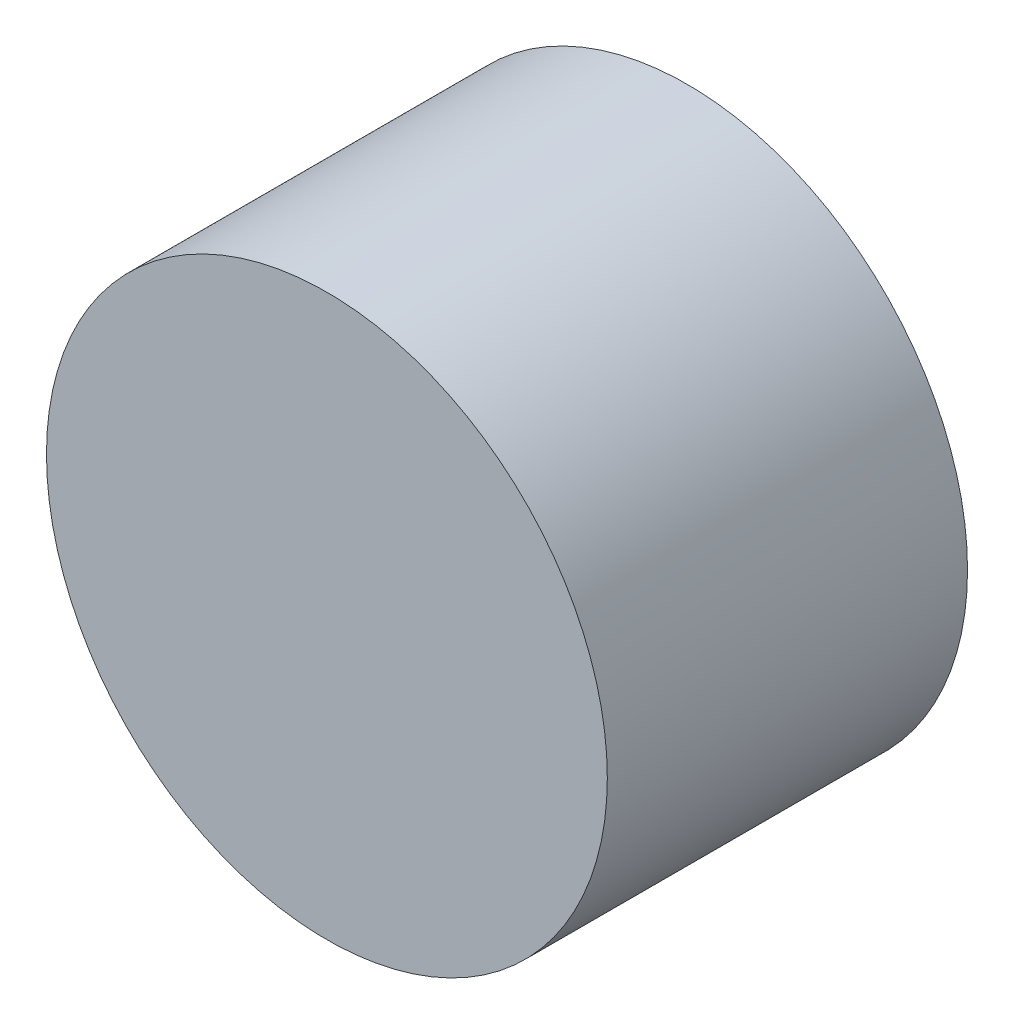
ISO-10303-21;
HEADER;
FILE_DESCRIPTION(('STEP AP214'),'2;1');
FILE_NAME('part.step','',(''),(''),'','','');
FILE_SCHEMA(('AUTOMOTIVE_DESIGN { 1 0 10303 214 1 1 1 1 }'));
ENDSEC;
DATA;
#1=APPLICATION_CONTEXT('core data for automotive mechanical design processes');
#2=APPLICATION_PROTOCOL_DEFINITION('international standard','automotive_design',2000,#1);
#3=PRODUCT_CONTEXT('',#1,'mechanical');
#4=PRODUCT('Part','Part','',(#3));
#5=PRODUCT_RELATED_PRODUCT_CATEGORY('part','',(#4));
#6=PRODUCT_DEFINITION_FORMATION('','',#4);
#7=PRODUCT_DEFINITION_CONTEXT('part definition',#1,'design');
#8=PRODUCT_DEFINITION('design','',#6,#7);
#9=PRODUCT_DEFINITION_SHAPE('','',#8);
#10=(LENGTH_UNIT() NAMED_UNIT(*) SI_UNIT(.MILLI.,.METRE.));
#11=(NAMED_UNIT(*) PLANE_ANGLE_UNIT() SI_UNIT($,.RADIAN.));
#12=(NAMED_UNIT(*) SI_UNIT($,.STERADIAN.) SOLID_ANGLE_UNIT());
#13=UNCERTAINTY_MEASURE_WITH_UNIT(LENGTH_MEASURE(1.E-05),#10,'distance_accuracy_value','');
#14=(GEOMETRIC_REPRESENTATION_CONTEXT(3) GLOBAL_UNCERTAINTY_ASSIGNED_CONTEXT((#13)) GLOBAL_UNIT_ASSIGNED_CONTEXT((#10,
#11,#12)) REPRESENTATION_CONTEXT('',''));
#15=CARTESIAN_POINT('',(0.,0.,0.));
#16=DIRECTION('',(0.,0.,1.));
#17=DIRECTION('',(1.,0.,0.));
#18=AXIS2_PLACEMENT_3D('',#15,#16,#17);
#19=CARTESIAN_POINT('',(0.,0.,66.04));
#20=DIRECTION('',(0.,0.,-1.));
#21=DIRECTION('',(-1.,0.,0.));
#22=AXIS2_PLACEMENT_3D('',#19,#20,#21);
#23=CYLINDRICAL_SURFACE('',#22,51.414167009829);
#24=CARTESIAN_POINT('',(0.,0.,66.04));
#25=DIRECTION('',(0.,0.,1.));
#26=DIRECTION('',(1.,0.,0.));
#27=AXIS2_PLACEMENT_3D('',#24,#25,#26);
#28=CIRCLE('',#27,51.414167009829);
#29=CARTESIAN_POINT('',(51.414167009829,0.,66.04));
#30=VERTEX_POINT('',#29);
#31=EDGE_CURVE('E10',#30,#30,#28,.T.);
#32=ORIENTED_EDGE('',*,*,#31,.F.);
#33=EDGE_LOOP('',(#32));
#34=FACE_BOUND('',#33,.T.);
#35=CARTESIAN_POINT('',(0.,0.,0.));
#36=DIRECTION('',(0.,0.,1.));
#37=DIRECTION('',(1.,0.,0.));
#38=AXIS2_PLACEMENT_3D('',#35,#36,#37);
#39=CIRCLE('',#38,51.414167009829);
#40=CARTESIAN_POINT('',(51.414167009829,0.,0.));
#41=VERTEX_POINT('',#40);
#42=EDGE_CURVE('E34',#41,#41,#39,.T.);
#43=ORIENTED_EDGE('',*,*,#42,.T.);
#44=EDGE_LOOP('',(#43));
#45=FACE_BOUND('',#44,.T.);
#46=ADVANCED_FACE('F31',(#34,#45),#23,.T.);
#47=CARTESIAN_POINT('',(0.,0.,66.04));
#48=DIRECTION('',(0.,0.,1.));
#49=DIRECTION('',(1.,0.,0.));
#50=AXIS2_PLACEMENT_3D('',#47,#48,#49);
#51=PLANE('',#50);
#52=ORIENTED_EDGE('',*,*,#31,.T.);
#53=EDGE_LOOP('',(#52));
#54=FACE_BOUND('',#53,.T.);
#55=ADVANCED_FACE('F46',(#54),#51,.T.);
#56=CARTESIAN_POINT('',(0.,0.,0.));
#57=DIRECTION('',(0.,0.,1.));
#58=DIRECTION('',(1.,0.,0.));
#59=AXIS2_PLACEMENT_3D('',#56,#57,#58);
#60=PLANE('',#59);
#61=ORIENTED_EDGE('',*,*,#42,.F.);
#62=EDGE_LOOP('',(#61));
#63=FACE_BOUND('',#62,.T.);
#64=ADVANCED_FACE('F44',(#63),#60,.F.);
#65=CLOSED_SHELL('',(#46,#55,#64));
#66=MANIFOLD_SOLID_BREP('B2',#65);
#67=ADVANCED_BREP_SHAPE_REPRESENTATION('',(#18,#66),#14);
#68=SHAPE_DEFINITION_REPRESENTATION(#9,#67);
ENDSEC;
END-ISO-10303-21;
